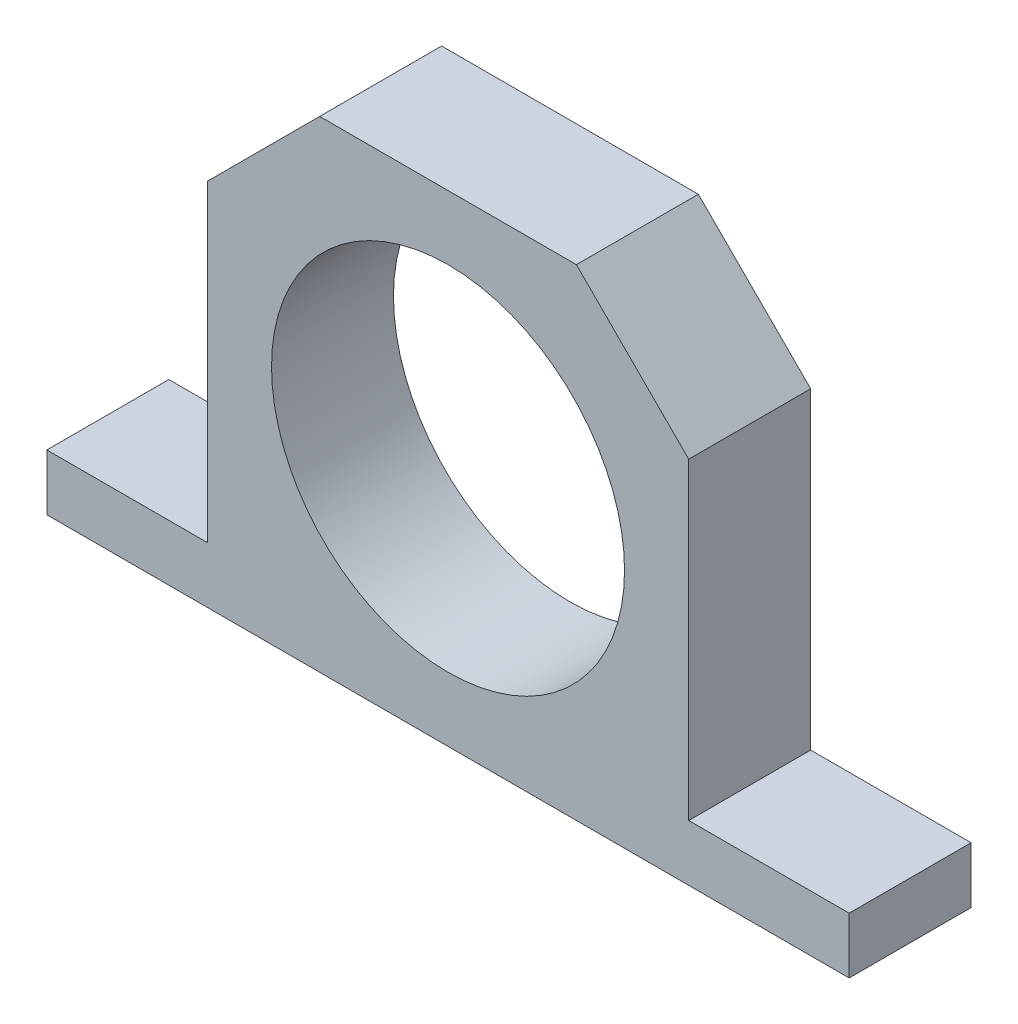
ISO-10303-21;
HEADER;
FILE_DESCRIPTION(('STEP AP214'),'2;1');
FILE_NAME('part.step','',(''),(''),'','','');
FILE_SCHEMA(('AUTOMOTIVE_DESIGN { 1 0 10303 214 1 1 1 1 }'));
ENDSEC;
DATA;
#1=APPLICATION_CONTEXT('core data for automotive mechanical design processes');
#2=APPLICATION_PROTOCOL_DEFINITION('international standard','automotive_design',2000,#1);
#3=PRODUCT_CONTEXT('',#1,'mechanical');
#4=PRODUCT('Part','Part','',(#3));
#5=PRODUCT_RELATED_PRODUCT_CATEGORY('part','',(#4));
#6=PRODUCT_DEFINITION_FORMATION('','',#4);
#7=PRODUCT_DEFINITION_CONTEXT('part definition',#1,'design');
#8=PRODUCT_DEFINITION('design','',#6,#7);
#9=PRODUCT_DEFINITION_SHAPE('','',#8);
#10=(LENGTH_UNIT() NAMED_UNIT(*) SI_UNIT(.MILLI.,.METRE.));
#11=(NAMED_UNIT(*) PLANE_ANGLE_UNIT() SI_UNIT($,.RADIAN.));
#12=(NAMED_UNIT(*) SI_UNIT($,.STERADIAN.) SOLID_ANGLE_UNIT());
#13=UNCERTAINTY_MEASURE_WITH_UNIT(LENGTH_MEASURE(1.E-05),#10,'distance_accuracy_value','');
#14=(GEOMETRIC_REPRESENTATION_CONTEXT(3) GLOBAL_UNCERTAINTY_ASSIGNED_CONTEXT((#13)) GLOBAL_UNIT_ASSIGNED_CONTEXT((#10,
#11,#12)) REPRESENTATION_CONTEXT('',''));
#15=CARTESIAN_POINT('',(0.,0.,0.));
#16=DIRECTION('',(0.,0.,1.));
#17=DIRECTION('',(1.,0.,0.));
#18=AXIS2_PLACEMENT_3D('',#15,#16,#17);
#19=CARTESIAN_POINT('',(-15.,30.,3.8));
#20=DIRECTION('',(0.,0.,-1.));
#21=DIRECTION('',(-1.,0.,0.));
#22=AXIS2_PLACEMENT_3D('',#19,#20,#21);
#23=PLANE('',#22);
#24=CARTESIAN_POINT('',(0.,15.,3.8));
#25=DIRECTION('',(0.,0.,1.));
#26=DIRECTION('',(1.,0.,0.));
#27=AXIS2_PLACEMENT_3D('',#24,#25,#26);
#28=CIRCLE('',#27,11.);
#29=CARTESIAN_POINT('',(11.,15.,3.8));
#30=VERTEX_POINT('',#29);
#31=EDGE_CURVE('E178',#30,#30,#28,.T.);
#32=ORIENTED_EDGE('',*,*,#31,.F.);
#33=EDGE_LOOP('',(#32));
#34=FACE_BOUND('',#33,.T.);
#35=DIRECTION('',(0.,-1.,0.));
#36=VECTOR('',#35,1.);
#37=CARTESIAN_POINT('',(-15.,30.,3.8));
#38=LINE('',#37,#36);
#39=CARTESIAN_POINT('',(-15.,23.,3.8));
#40=VERTEX_POINT('',#39);
#41=CARTESIAN_POINT('',(-15.,3.5,3.8));
#42=VERTEX_POINT('',#41);
#43=EDGE_CURVE('E204',#40,#42,#38,.T.);
#44=ORIENTED_EDGE('',*,*,#43,.T.);
#45=DIRECTION('',(1.,0.,0.));
#46=VECTOR('',#45,1.);
#47=CARTESIAN_POINT('',(-25.,3.5,3.8));
#48=LINE('',#47,#46);
#49=CARTESIAN_POINT('',(-25.,3.5,3.8));
#50=VERTEX_POINT('',#49);
#51=EDGE_CURVE('E172',#50,#42,#48,.T.);
#52=ORIENTED_EDGE('',*,*,#51,.F.);
#53=DIRECTION('',(0.,-1.,0.));
#54=VECTOR('',#53,1.);
#55=CARTESIAN_POINT('',(-25.,3.5,3.8));
#56=LINE('',#55,#54);
#57=CARTESIAN_POINT('',(-25.,0.,3.8));
#58=VERTEX_POINT('',#57);
#59=EDGE_CURVE('E169',#50,#58,#56,.T.);
#60=ORIENTED_EDGE('',*,*,#59,.T.);
#61=DIRECTION('',(1.,0.,0.));
#62=VECTOR('',#61,1.);
#63=CARTESIAN_POINT('',(-15.,0.,3.8));
#64=LINE('',#63,#62);
#65=CARTESIAN_POINT('',(25.,0.,3.8));
#66=VERTEX_POINT('',#65);
#67=EDGE_CURVE('E205',#58,#66,#64,.T.);
#68=ORIENTED_EDGE('',*,*,#67,.T.);
#69=DIRECTION('',(0.,-1.,0.));
#70=VECTOR('',#69,1.);
#71=CARTESIAN_POINT('',(25.,3.5,3.8));
#72=LINE('',#71,#70);
#73=CARTESIAN_POINT('',(25.,3.5,3.8));
#74=VERTEX_POINT('',#73);
#75=EDGE_CURVE('E166',#74,#66,#72,.T.);
#76=ORIENTED_EDGE('',*,*,#75,.F.);
#77=CARTESIAN_POINT('',(15.,3.5,3.8));
#78=VERTEX_POINT('',#77);
#79=EDGE_CURVE('E158',#78,#74,#48,.T.);
#80=ORIENTED_EDGE('',*,*,#79,.F.);
#81=DIRECTION('',(0.,-1.,0.));
#82=VECTOR('',#81,1.);
#83=CARTESIAN_POINT('',(15.,30.,3.8));
#84=LINE('',#83,#82);
#85=CARTESIAN_POINT('',(15.,23.,3.8));
#86=VERTEX_POINT('',#85);
#87=EDGE_CURVE('E211',#86,#78,#84,.T.);
#88=ORIENTED_EDGE('',*,*,#87,.F.);
#89=DIRECTION('',(-0.707106781186548,0.707106781186548,0.));
#90=VECTOR('',#89,1.);
#91=CARTESIAN_POINT('',(19.,19.,3.8));
#92=LINE('',#91,#90);
#93=CARTESIAN_POINT('',(7.99999999999999,30.,3.8));
#94=VERTEX_POINT('',#93);
#95=EDGE_CURVE('E185',#86,#94,#92,.T.);
#96=ORIENTED_EDGE('',*,*,#95,.T.);
#97=DIRECTION('',(1.,0.,0.));
#98=VECTOR('',#97,1.);
#99=CARTESIAN_POINT('',(-15.,30.,3.8));
#100=LINE('',#99,#98);
#101=CARTESIAN_POINT('',(-8.,30.,3.8));
#102=VERTEX_POINT('',#101);
#103=EDGE_CURVE('E197',#102,#94,#100,.T.);
#104=ORIENTED_EDGE('',*,*,#103,.F.);
#105=DIRECTION('',(0.707106781186548,0.707106781186547,0.));
#106=VECTOR('',#105,1.);
#107=CARTESIAN_POINT('',(-19.,19.,3.8));
#108=LINE('',#107,#106);
#109=EDGE_CURVE('E188',#40,#102,#108,.T.);
#110=ORIENTED_EDGE('',*,*,#109,.F.);
#111=EDGE_LOOP('',(#44,#52,#60,#68,#76,#80,#88,#96,#104,#110));
#112=FACE_BOUND('',#111,.T.);
#113=ADVANCED_FACE('F65',(#34,#112),#23,.F.);
#114=CARTESIAN_POINT('',(15.,30.,-3.8));
#115=DIRECTION('',(1.,0.,0.));
#116=DIRECTION('',(0.,0.,-1.));
#117=AXIS2_PLACEMENT_3D('',#114,#115,#116);
#118=PLANE('',#117);
#119=DIRECTION('',(0.,0.,1.));
#120=VECTOR('',#119,1.);
#121=CARTESIAN_POINT('',(15.,3.5,-3.8));
#122=LINE('',#121,#120);
#123=CARTESIAN_POINT('',(15.,3.5,-3.8));
#124=VERTEX_POINT('',#123);
#125=EDGE_CURVE('E176',#124,#78,#122,.T.);
#126=ORIENTED_EDGE('',*,*,#125,.F.);
#127=DIRECTION('',(0.,-1.,0.));
#128=VECTOR('',#127,1.);
#129=CARTESIAN_POINT('',(15.,30.,-3.8));
#130=LINE('',#129,#128);
#131=CARTESIAN_POINT('',(15.,23.,-3.8));
#132=VERTEX_POINT('',#131);
#133=EDGE_CURVE('E148',#132,#124,#130,.T.);
#134=ORIENTED_EDGE('',*,*,#133,.F.);
#135=DIRECTION('',(0.,0.,1.));
#136=VECTOR('',#135,1.);
#137=CARTESIAN_POINT('',(15.,23.,-26.2));
#138=LINE('',#137,#136);
#139=EDGE_CURVE('E182',#132,#86,#138,.T.);
#140=ORIENTED_EDGE('',*,*,#139,.T.);
#141=ORIENTED_EDGE('',*,*,#87,.T.);
#142=EDGE_LOOP('',(#126,#134,#140,#141));
#143=FACE_BOUND('',#142,.T.);
#144=ADVANCED_FACE('F224',(#143),#118,.T.);
#145=CARTESIAN_POINT('',(-15.,30.,-3.8));
#146=DIRECTION('',(0.,0.,-1.));
#147=DIRECTION('',(-1.,0.,0.));
#148=AXIS2_PLACEMENT_3D('',#145,#146,#147);
#149=PLANE('',#148);
#150=ORIENTED_EDGE('',*,*,#133,.T.);
#151=DIRECTION('',(1.,0.,0.));
#152=VECTOR('',#151,1.);
#153=CARTESIAN_POINT('',(-25.,3.5,-3.8));
#154=LINE('',#153,#152);
#155=CARTESIAN_POINT('',(25.,3.5,-3.8));
#156=VERTEX_POINT('',#155);
#157=EDGE_CURVE('E139',#124,#156,#154,.T.);
#158=ORIENTED_EDGE('',*,*,#157,.T.);
#159=DIRECTION('',(0.,-1.,0.));
#160=VECTOR('',#159,1.);
#161=CARTESIAN_POINT('',(25.,3.5,-3.8));
#162=LINE('',#161,#160);
#163=CARTESIAN_POINT('',(25.,0.,-3.8));
#164=VERTEX_POINT('',#163);
#165=EDGE_CURVE('E144',#156,#164,#162,.T.);
#166=ORIENTED_EDGE('',*,*,#165,.T.);
#167=DIRECTION('',(1.,0.,0.));
#168=VECTOR('',#167,1.);
#169=CARTESIAN_POINT('',(-15.,0.,-3.8));
#170=LINE('',#169,#168);
#171=CARTESIAN_POINT('',(-25.,0.,-3.8));
#172=VERTEX_POINT('',#171);
#173=EDGE_CURVE('E201',#172,#164,#170,.T.);
#174=ORIENTED_EDGE('',*,*,#173,.F.);
#175=DIRECTION('',(0.,-1.,0.));
#176=VECTOR('',#175,1.);
#177=CARTESIAN_POINT('',(-25.,3.5,-3.8));
#178=LINE('',#177,#176);
#179=CARTESIAN_POINT('',(-25.,3.5,-3.8));
#180=VERTEX_POINT('',#179);
#181=EDGE_CURVE('E179',#180,#172,#178,.T.);
#182=ORIENTED_EDGE('',*,*,#181,.F.);
#183=CARTESIAN_POINT('',(-15.,3.5,-3.8));
#184=VERTEX_POINT('',#183);
#185=EDGE_CURVE('E151',#180,#184,#154,.T.);
#186=ORIENTED_EDGE('',*,*,#185,.T.);
#187=DIRECTION('',(0.,-1.,0.));
#188=VECTOR('',#187,1.);
#189=CARTESIAN_POINT('',(-15.,30.,-3.8));
#190=LINE('',#189,#188);
#191=CARTESIAN_POINT('',(-15.,23.,-3.8));
#192=VERTEX_POINT('',#191);
#193=EDGE_CURVE('E78',#192,#184,#190,.T.);
#194=ORIENTED_EDGE('',*,*,#193,.F.);
#195=DIRECTION('',(-0.707106781186548,-0.707106781186547,0.));
#196=VECTOR('',#195,1.);
#197=CARTESIAN_POINT('',(-11.5,26.5,-3.8));
#198=LINE('',#197,#196);
#199=CARTESIAN_POINT('',(-8.,30.,-3.8));
#200=VERTEX_POINT('',#199);
#201=EDGE_CURVE('E192',#200,#192,#198,.T.);
#202=ORIENTED_EDGE('',*,*,#201,.F.);
#203=DIRECTION('',(1.,0.,0.));
#204=VECTOR('',#203,1.);
#205=CARTESIAN_POINT('',(-15.,30.,-3.8));
#206=LINE('',#205,#204);
#207=CARTESIAN_POINT('',(7.99999999999998,30.,-3.8));
#208=VERTEX_POINT('',#207);
#209=EDGE_CURVE('E200',#200,#208,#206,.T.);
#210=ORIENTED_EDGE('',*,*,#209,.T.);
#211=DIRECTION('',(0.707106781186548,-0.707106781186548,0.));
#212=VECTOR('',#211,1.);
#213=CARTESIAN_POINT('',(-3.50000000000001,41.5,-3.8));
#214=LINE('',#213,#212);
#215=EDGE_CURVE('E194',#208,#132,#214,.T.);
#216=ORIENTED_EDGE('',*,*,#215,.T.);
#217=EDGE_LOOP('',(#150,#158,#166,#174,#182,#186,#194,#202,#210,#216));
#218=FACE_BOUND('',#217,.T.);
#219=CARTESIAN_POINT('',(0.,15.,-3.8));
#220=DIRECTION('',(0.,0.,-1.));
#221=DIRECTION('',(-1.,0.,0.));
#222=AXIS2_PLACEMENT_3D('',#219,#220,#221);
#223=CIRCLE('',#222,11.);
#224=CARTESIAN_POINT('',(-11.,15.,-3.8));
#225=VERTEX_POINT('',#224);
#226=EDGE_CURVE('E196',#225,#225,#223,.T.);
#227=ORIENTED_EDGE('',*,*,#226,.F.);
#228=EDGE_LOOP('',(#227));
#229=FACE_BOUND('',#228,.T.);
#230=ADVANCED_FACE('F141',(#218,#229),#149,.T.);
#231=CARTESIAN_POINT('',(0.,30.,0.));
#232=DIRECTION('',(0.,-1.,0.));
#233=DIRECTION('',(0.,0.,-1.));
#234=AXIS2_PLACEMENT_3D('',#231,#232,#233);
#235=PLANE('',#234);
#236=DIRECTION('',(0.,0.,1.));
#237=VECTOR('',#236,1.);
#238=CARTESIAN_POINT('',(7.99999999999999,30.,0.));
#239=LINE('',#238,#237);
#240=EDGE_CURVE('E72',#208,#94,#239,.T.);
#241=ORIENTED_EDGE('',*,*,#240,.F.);
#242=ORIENTED_EDGE('',*,*,#209,.F.);
#243=DIRECTION('',(0.,0.,1.));
#244=VECTOR('',#243,1.);
#245=CARTESIAN_POINT('',(-8.,30.,0.));
#246=LINE('',#245,#244);
#247=EDGE_CURVE('E214',#200,#102,#246,.T.);
#248=ORIENTED_EDGE('',*,*,#247,.T.);
#249=ORIENTED_EDGE('',*,*,#103,.T.);
#250=EDGE_LOOP('',(#241,#242,#248,#249));
#251=FACE_BOUND('',#250,.T.);
#252=ADVANCED_FACE('F223',(#251),#235,.F.);
#253=CARTESIAN_POINT('',(-15.,30.,-3.8));
#254=DIRECTION('',(1.,0.,0.));
#255=DIRECTION('',(0.,0.,-1.));
#256=AXIS2_PLACEMENT_3D('',#253,#254,#255);
#257=PLANE('',#256);
#258=ORIENTED_EDGE('',*,*,#193,.T.);
#259=DIRECTION('',(0.,0.,1.));
#260=VECTOR('',#259,1.);
#261=CARTESIAN_POINT('',(-15.,3.5,-3.8));
#262=LINE('',#261,#260);
#263=EDGE_CURVE('E12',#184,#42,#262,.T.);
#264=ORIENTED_EDGE('',*,*,#263,.T.);
#265=ORIENTED_EDGE('',*,*,#43,.F.);
#266=DIRECTION('',(0.,0.,1.));
#267=VECTOR('',#266,1.);
#268=CARTESIAN_POINT('',(-15.,23.,-26.2));
#269=LINE('',#268,#267);
#270=EDGE_CURVE('E190',#192,#40,#269,.T.);
#271=ORIENTED_EDGE('',*,*,#270,.F.);
#272=EDGE_LOOP('',(#258,#264,#265,#271));
#273=FACE_BOUND('',#272,.T.);
#274=ADVANCED_FACE('F231',(#273),#257,.F.);
#275=CARTESIAN_POINT('',(0.,0.,0.));
#276=DIRECTION('',(0.,-1.,0.));
#277=DIRECTION('',(0.,0.,-1.));
#278=AXIS2_PLACEMENT_3D('',#275,#276,#277);
#279=PLANE('',#278);
#280=ORIENTED_EDGE('',*,*,#67,.F.);
#281=DIRECTION('',(0.,0.,-1.));
#282=VECTOR('',#281,1.);
#283=CARTESIAN_POINT('',(-25.,0.,3.8));
#284=LINE('',#283,#282);
#285=EDGE_CURVE('E152',#58,#172,#284,.T.);
#286=ORIENTED_EDGE('',*,*,#285,.T.);
#287=ORIENTED_EDGE('',*,*,#173,.T.);
#288=DIRECTION('',(0.,0.,-1.));
#289=VECTOR('',#288,1.);
#290=CARTESIAN_POINT('',(25.,0.,3.8));
#291=LINE('',#290,#289);
#292=EDGE_CURVE('E165',#66,#164,#291,.T.);
#293=ORIENTED_EDGE('',*,*,#292,.F.);
#294=EDGE_LOOP('',(#280,#286,#287,#293));
#295=FACE_BOUND('',#294,.T.);
#296=ADVANCED_FACE('F261',(#295),#279,.T.);
#297=CARTESIAN_POINT('',(-19.,19.,-26.2));
#298=DIRECTION('',(0.707106781186547,-0.707106781186548,0.));
#299=DIRECTION('',(0.707106781186548,0.707106781186547,0.));
#300=AXIS2_PLACEMENT_3D('',#297,#298,#299);
#301=PLANE('',#300);
#302=ORIENTED_EDGE('',*,*,#201,.T.);
#303=ORIENTED_EDGE('',*,*,#270,.T.);
#304=ORIENTED_EDGE('',*,*,#109,.T.);
#305=ORIENTED_EDGE('',*,*,#247,.F.);
#306=EDGE_LOOP('',(#302,#303,#304,#305));
#307=FACE_BOUND('',#306,.T.);
#308=ADVANCED_FACE('F270',(#307),#301,.F.);
#309=CARTESIAN_POINT('',(19.,19.,-26.2));
#310=DIRECTION('',(0.707106781186548,0.707106781186548,0.));
#311=DIRECTION('',(-0.707106781186548,0.707106781186548,0.));
#312=AXIS2_PLACEMENT_3D('',#309,#310,#311);
#313=PLANE('',#312);
#314=ORIENTED_EDGE('',*,*,#240,.T.);
#315=ORIENTED_EDGE('',*,*,#95,.F.);
#316=ORIENTED_EDGE('',*,*,#139,.F.);
#317=ORIENTED_EDGE('',*,*,#215,.F.);
#318=EDGE_LOOP('',(#314,#315,#316,#317));
#319=FACE_BOUND('',#318,.T.);
#320=ADVANCED_FACE('F267',(#319),#313,.T.);
#321=CARTESIAN_POINT('',(0.,15.,-26.2));
#322=DIRECTION('',(0.,0.,1.));
#323=DIRECTION('',(1.,0.,0.));
#324=AXIS2_PLACEMENT_3D('',#321,#322,#323);
#325=CYLINDRICAL_SURFACE('',#324,11.);
#326=ORIENTED_EDGE('',*,*,#226,.T.);
#327=EDGE_LOOP('',(#326));
#328=FACE_BOUND('',#327,.T.);
#329=ORIENTED_EDGE('',*,*,#31,.T.);
#330=EDGE_LOOP('',(#329));
#331=FACE_BOUND('',#330,.T.);
#332=ADVANCED_FACE('F220',(#328,#331),#325,.F.);
#333=CARTESIAN_POINT('',(-25.,3.5,3.8));
#334=DIRECTION('',(-1.,0.,0.));
#335=DIRECTION('',(0.,0.,1.));
#336=AXIS2_PLACEMENT_3D('',#333,#334,#335);
#337=PLANE('',#336);
#338=ORIENTED_EDGE('',*,*,#285,.F.);
#339=ORIENTED_EDGE('',*,*,#59,.F.);
#340=DIRECTION('',(0.,0.,-1.));
#341=VECTOR('',#340,1.);
#342=CARTESIAN_POINT('',(-25.,3.5,3.8));
#343=LINE('',#342,#341);
#344=EDGE_CURVE('E167',#50,#180,#343,.T.);
#345=ORIENTED_EDGE('',*,*,#344,.T.);
#346=ORIENTED_EDGE('',*,*,#181,.T.);
#347=EDGE_LOOP('',(#338,#339,#345,#346));
#348=FACE_BOUND('',#347,.T.);
#349=ADVANCED_FACE('F259',(#348),#337,.T.);
#350=CARTESIAN_POINT('',(0.,3.5,0.));
#351=DIRECTION('',(0.,1.,0.));
#352=DIRECTION('',(0.,0.,1.));
#353=AXIS2_PLACEMENT_3D('',#350,#351,#352);
#354=PLANE('',#353);
#355=ORIENTED_EDGE('',*,*,#263,.F.);
#356=ORIENTED_EDGE('',*,*,#185,.F.);
#357=ORIENTED_EDGE('',*,*,#344,.F.);
#358=ORIENTED_EDGE('',*,*,#51,.T.);
#359=EDGE_LOOP('',(#355,#356,#357,#358));
#360=FACE_BOUND('',#359,.T.);
#361=ADVANCED_FACE('F248',(#360),#354,.T.);
#362=CARTESIAN_POINT('',(25.,3.5,3.8));
#363=DIRECTION('',(-1.,0.,0.));
#364=DIRECTION('',(0.,0.,1.));
#365=AXIS2_PLACEMENT_3D('',#362,#363,#364);
#366=PLANE('',#365);
#367=ORIENTED_EDGE('',*,*,#292,.T.);
#368=ORIENTED_EDGE('',*,*,#165,.F.);
#369=DIRECTION('',(0.,0.,-1.));
#370=VECTOR('',#369,1.);
#371=CARTESIAN_POINT('',(25.,3.5,3.8));
#372=LINE('',#371,#370);
#373=EDGE_CURVE('E155',#74,#156,#372,.T.);
#374=ORIENTED_EDGE('',*,*,#373,.F.);
#375=ORIENTED_EDGE('',*,*,#75,.T.);
#376=EDGE_LOOP('',(#367,#368,#374,#375));
#377=FACE_BOUND('',#376,.T.);
#378=ADVANCED_FACE('F163',(#377),#366,.F.);
#379=ORIENTED_EDGE('',*,*,#157,.F.);
#380=ORIENTED_EDGE('',*,*,#125,.T.);
#381=ORIENTED_EDGE('',*,*,#79,.T.);
#382=ORIENTED_EDGE('',*,*,#373,.T.);
#383=EDGE_LOOP('',(#379,#380,#381,#382));
#384=FACE_BOUND('',#383,.T.);
#385=ADVANCED_FACE('F156',(#384),#354,.T.);
#386=CLOSED_SHELL('',(#113,#144,#230,#252,#274,#296,#308,#320,#332,#349,#361,#378,#385));
#387=MANIFOLD_SOLID_BREP('B2',#386);
#388=ADVANCED_BREP_SHAPE_REPRESENTATION('',(#18,#387),#14);
#389=SHAPE_DEFINITION_REPRESENTATION(#9,#388);
ENDSEC;
END-ISO-10303-21;
